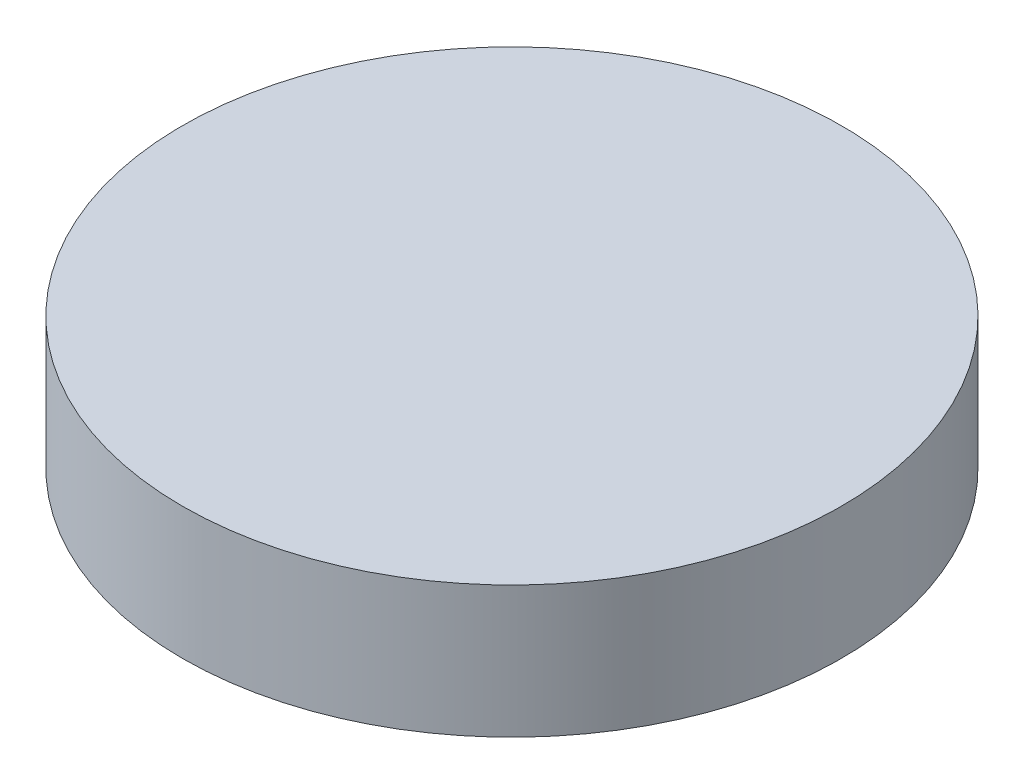
ISO-10303-21;
HEADER;
FILE_DESCRIPTION(('STEP AP214'),'2;1');
FILE_NAME('part.step','',(''),(''),'','','');
FILE_SCHEMA(('AUTOMOTIVE_DESIGN { 1 0 10303 214 1 1 1 1 }'));
ENDSEC;
DATA;
#1=APPLICATION_CONTEXT('core data for automotive mechanical design processes');
#2=APPLICATION_PROTOCOL_DEFINITION('international standard','automotive_design',2000,#1);
#3=PRODUCT_CONTEXT('',#1,'mechanical');
#4=PRODUCT('Part','Part','',(#3));
#5=PRODUCT_RELATED_PRODUCT_CATEGORY('part','',(#4));
#6=PRODUCT_DEFINITION_FORMATION('','',#4);
#7=PRODUCT_DEFINITION_CONTEXT('part definition',#1,'design');
#8=PRODUCT_DEFINITION('design','',#6,#7);
#9=PRODUCT_DEFINITION_SHAPE('','',#8);
#10=(LENGTH_UNIT() NAMED_UNIT(*) SI_UNIT(.MILLI.,.METRE.));
#11=(NAMED_UNIT(*) PLANE_ANGLE_UNIT() SI_UNIT($,.RADIAN.));
#12=(NAMED_UNIT(*) SI_UNIT($,.STERADIAN.) SOLID_ANGLE_UNIT());
#13=UNCERTAINTY_MEASURE_WITH_UNIT(LENGTH_MEASURE(1.E-05),#10,'distance_accuracy_value','');
#14=(GEOMETRIC_REPRESENTATION_CONTEXT(3) GLOBAL_UNCERTAINTY_ASSIGNED_CONTEXT((#13)) GLOBAL_UNIT_ASSIGNED_CONTEXT((#10,
#11,#12)) REPRESENTATION_CONTEXT('',''));
#15=CARTESIAN_POINT('',(0.,0.,0.));
#16=DIRECTION('',(0.,0.,1.));
#17=DIRECTION('',(1.,0.,0.));
#18=AXIS2_PLACEMENT_3D('',#15,#16,#17);
#19=CARTESIAN_POINT('',(0.,20.,0.));
#20=DIRECTION('',(0.,-1.,0.));
#21=DIRECTION('',(0.,0.,-1.));
#22=AXIS2_PLACEMENT_3D('',#19,#20,#21);
#23=CYLINDRICAL_SURFACE('',#22,50.);
#24=CARTESIAN_POINT('',(0.,20.,0.));
#25=DIRECTION('',(0.,1.,0.));
#26=DIRECTION('',(0.,0.,1.));
#27=AXIS2_PLACEMENT_3D('',#24,#25,#26);
#28=CIRCLE('',#27,50.);
#29=CARTESIAN_POINT('',(0.,20.,50.));
#30=VERTEX_POINT('',#29);
#31=EDGE_CURVE('E10',#30,#30,#28,.T.);
#32=ORIENTED_EDGE('',*,*,#31,.F.);
#33=EDGE_LOOP('',(#32));
#34=FACE_BOUND('',#33,.T.);
#35=CARTESIAN_POINT('',(0.,0.,0.));
#36=DIRECTION('',(0.,1.,0.));
#37=DIRECTION('',(0.,0.,1.));
#38=AXIS2_PLACEMENT_3D('',#35,#36,#37);
#39=CIRCLE('',#38,50.);
#40=CARTESIAN_POINT('',(0.,0.,50.));
#41=VERTEX_POINT('',#40);
#42=EDGE_CURVE('E46',#41,#41,#39,.T.);
#43=ORIENTED_EDGE('',*,*,#42,.T.);
#44=EDGE_LOOP('',(#43));
#45=FACE_BOUND('',#44,.T.);
#46=ADVANCED_FACE('F43',(#34,#45),#23,.T.);
#47=CARTESIAN_POINT('',(0.,20.,0.));
#48=DIRECTION('',(0.,1.,0.));
#49=DIRECTION('',(0.,0.,1.));
#50=AXIS2_PLACEMENT_3D('',#47,#48,#49);
#51=PLANE('',#50);
#52=ORIENTED_EDGE('',*,*,#31,.T.);
#53=EDGE_LOOP('',(#52));
#54=FACE_BOUND('',#53,.T.);
#55=ADVANCED_FACE('F60',(#54),#51,.T.);
#56=CARTESIAN_POINT('',(0.,0.,0.));
#57=DIRECTION('',(0.,1.,0.));
#58=DIRECTION('',(0.,0.,1.));
#59=AXIS2_PLACEMENT_3D('',#56,#57,#58);
#60=PLANE('',#59);
#61=ORIENTED_EDGE('',*,*,#42,.F.);
#62=EDGE_LOOP('',(#61));
#63=FACE_BOUND('',#62,.T.);
#64=ADVANCED_FACE('F58',(#63),#60,.F.);
#65=CLOSED_SHELL('',(#46,#55,#64));
#66=MANIFOLD_SOLID_BREP('B2',#65);
#67=ADVANCED_BREP_SHAPE_REPRESENTATION('',(#18,#66),#14);
#68=SHAPE_DEFINITION_REPRESENTATION(#9,#67);
ENDSEC;
END-ISO-10303-21;
